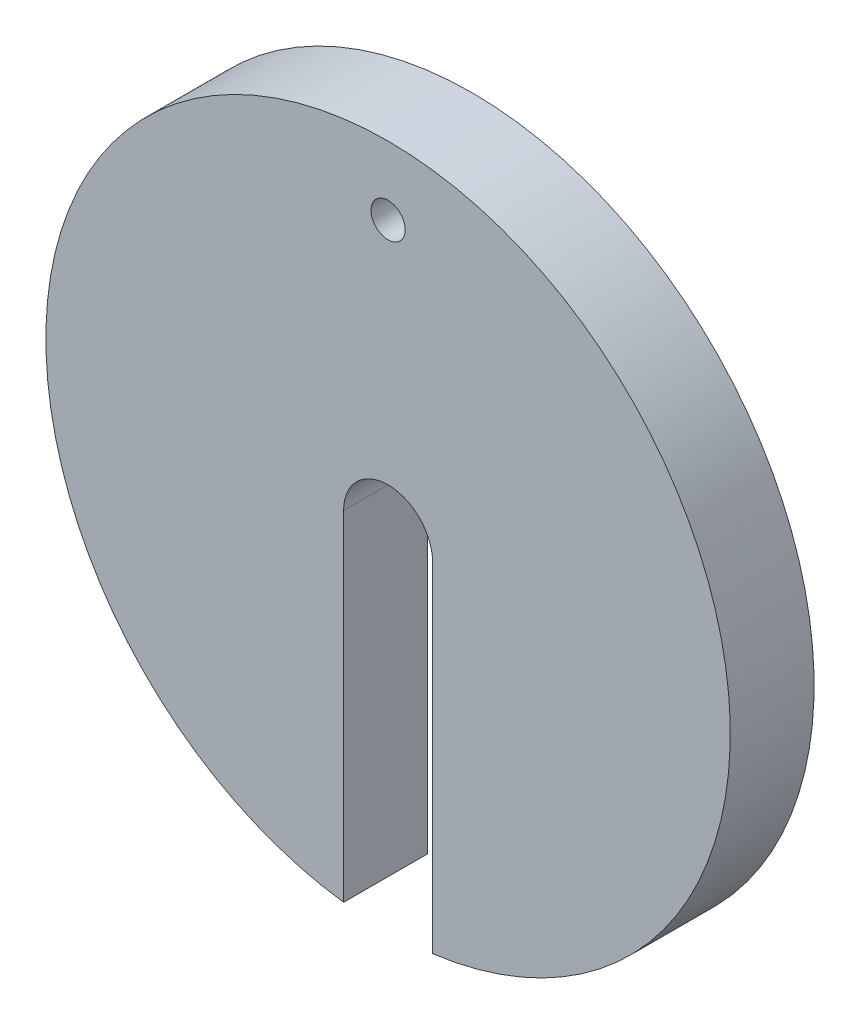
ISO-10303-21;
HEADER;
FILE_DESCRIPTION(('STEP AP214'),'2;1');
FILE_NAME('part.step','',(''),(''),'','','');
FILE_SCHEMA(('AUTOMOTIVE_DESIGN { 1 0 10303 214 1 1 1 1 }'));
ENDSEC;
DATA;
#1=APPLICATION_CONTEXT('core data for automotive mechanical design processes');
#2=APPLICATION_PROTOCOL_DEFINITION('international standard','automotive_design',2000,#1);
#3=PRODUCT_CONTEXT('',#1,'mechanical');
#4=PRODUCT('Part','Part','',(#3));
#5=PRODUCT_RELATED_PRODUCT_CATEGORY('part','',(#4));
#6=PRODUCT_DEFINITION_FORMATION('','',#4);
#7=PRODUCT_DEFINITION_CONTEXT('part definition',#1,'design');
#8=PRODUCT_DEFINITION('design','',#6,#7);
#9=PRODUCT_DEFINITION_SHAPE('','',#8);
#10=(LENGTH_UNIT() NAMED_UNIT(*) SI_UNIT(.MILLI.,.METRE.));
#11=(NAMED_UNIT(*) PLANE_ANGLE_UNIT() SI_UNIT($,.RADIAN.));
#12=(NAMED_UNIT(*) SI_UNIT($,.STERADIAN.) SOLID_ANGLE_UNIT());
#13=UNCERTAINTY_MEASURE_WITH_UNIT(LENGTH_MEASURE(1.E-05),#10,'distance_accuracy_value','');
#14=(GEOMETRIC_REPRESENTATION_CONTEXT(3) GLOBAL_UNCERTAINTY_ASSIGNED_CONTEXT((#13)) GLOBAL_UNIT_ASSIGNED_CONTEXT((#10,
#11,#12)) REPRESENTATION_CONTEXT('',''));
#15=CARTESIAN_POINT('',(0.,0.,0.));
#16=DIRECTION('',(0.,0.,1.));
#17=DIRECTION('',(1.,0.,0.));
#18=AXIS2_PLACEMENT_3D('',#15,#16,#17);
#19=CARTESIAN_POINT('',(0.,0.,12.25));
#20=DIRECTION('',(0.,0.,1.));
#21=DIRECTION('',(1.,0.,0.));
#22=AXIS2_PLACEMENT_3D('',#19,#20,#21);
#23=PLANE('',#22);
#24=CARTESIAN_POINT('',(0.,0.,12.25));
#25=DIRECTION('',(0.,0.,-1.));
#26=DIRECTION('',(1.,0.,0.));
#27=AXIS2_PLACEMENT_3D('',#24,#25,#26);
#28=CIRCLE('',#27,6.5);
#29=CARTESIAN_POINT('',(-6.5,0.,12.25));
#30=VERTEX_POINT('',#29);
#31=CARTESIAN_POINT('',(6.5,0.,12.25));
#32=VERTEX_POINT('',#31);
#33=EDGE_CURVE('E108',#30,#32,#28,.T.);
#34=ORIENTED_EDGE('',*,*,#33,.T.);
#35=DIRECTION('',(0.,-1.,0.));
#36=VECTOR('',#35,1.);
#37=CARTESIAN_POINT('',(6.5,0.,12.25));
#38=LINE('',#37,#36);
#39=CARTESIAN_POINT('',(6.50000000000015,-49.5756996924905,12.25));
#40=VERTEX_POINT('',#39);
#41=EDGE_CURVE('E92',#32,#40,#38,.T.);
#42=ORIENTED_EDGE('',*,*,#41,.T.);
#43=CARTESIAN_POINT('',(0.,0.,12.25));
#44=DIRECTION('',(0.,0.,1.));
#45=DIRECTION('',(1.,0.,0.));
#46=AXIS2_PLACEMENT_3D('',#43,#44,#45);
#47=CIRCLE('',#46,50.);
#48=CARTESIAN_POINT('',(-6.5,-49.5756996924905,12.25));
#49=VERTEX_POINT('',#48);
#50=EDGE_CURVE('E58',#40,#49,#47,.T.);
#51=ORIENTED_EDGE('',*,*,#50,.T.);
#52=DIRECTION('',(0.,1.,0.));
#53=VECTOR('',#52,1.);
#54=CARTESIAN_POINT('',(-6.5,0.,12.25));
#55=LINE('',#54,#53);
#56=EDGE_CURVE('E53',#49,#30,#55,.T.);
#57=ORIENTED_EDGE('',*,*,#56,.T.);
#58=EDGE_LOOP('',(#34,#42,#51,#57));
#59=FACE_BOUND('',#58,.T.);
#60=CARTESIAN_POINT('',(0.,40.,12.25));
#61=DIRECTION('',(0.,0.,1.));
#62=DIRECTION('',(1.,0.,0.));
#63=AXIS2_PLACEMENT_3D('',#60,#61,#62);
#64=CIRCLE('',#63,2.5);
#65=CARTESIAN_POINT('',(2.5,40.,12.25));
#66=VERTEX_POINT('',#65);
#67=EDGE_CURVE('E97',#66,#66,#64,.T.);
#68=ORIENTED_EDGE('',*,*,#67,.F.);
#69=EDGE_LOOP('',(#68));
#70=FACE_BOUND('',#69,.T.);
#71=ADVANCED_FACE('F38',(#59,#70),#23,.T.);
#72=CARTESIAN_POINT('',(0.,0.,0.));
#73=DIRECTION('',(0.,0.,1.));
#74=DIRECTION('',(1.,0.,0.));
#75=AXIS2_PLACEMENT_3D('',#72,#73,#74);
#76=PLANE('',#75);
#77=CARTESIAN_POINT('',(0.,0.,0.));
#78=DIRECTION('',(0.,0.,-1.));
#79=DIRECTION('',(1.,0.,0.));
#80=AXIS2_PLACEMENT_3D('',#77,#78,#79);
#81=CIRCLE('',#80,6.5);
#82=CARTESIAN_POINT('',(-6.5,0.,0.));
#83=VERTEX_POINT('',#82);
#84=CARTESIAN_POINT('',(6.5,0.,0.));
#85=VERTEX_POINT('',#84);
#86=EDGE_CURVE('E84',#83,#85,#81,.T.);
#87=ORIENTED_EDGE('',*,*,#86,.F.);
#88=DIRECTION('',(0.,1.,0.));
#89=VECTOR('',#88,1.);
#90=CARTESIAN_POINT('',(-6.5,0.,0.));
#91=LINE('',#90,#89);
#92=CARTESIAN_POINT('',(-6.5,-49.5756996924905,0.));
#93=VERTEX_POINT('',#92);
#94=EDGE_CURVE('E106',#93,#83,#91,.T.);
#95=ORIENTED_EDGE('',*,*,#94,.F.);
#96=CARTESIAN_POINT('',(0.,0.,0.));
#97=DIRECTION('',(0.,0.,1.));
#98=DIRECTION('',(1.,0.,0.));
#99=AXIS2_PLACEMENT_3D('',#96,#97,#98);
#100=CIRCLE('',#99,50.);
#101=CARTESIAN_POINT('',(6.50000000000015,-49.5756996924905,0.));
#102=VERTEX_POINT('',#101);
#103=EDGE_CURVE('E85',#102,#93,#100,.T.);
#104=ORIENTED_EDGE('',*,*,#103,.F.);
#105=DIRECTION('',(0.,-1.,0.));
#106=VECTOR('',#105,1.);
#107=CARTESIAN_POINT('',(6.5,0.,0.));
#108=LINE('',#107,#106);
#109=EDGE_CURVE('E79',#85,#102,#108,.T.);
#110=ORIENTED_EDGE('',*,*,#109,.F.);
#111=EDGE_LOOP('',(#87,#95,#104,#110));
#112=FACE_BOUND('',#111,.T.);
#113=CARTESIAN_POINT('',(0.,40.,0.));
#114=DIRECTION('',(0.,0.,1.));
#115=DIRECTION('',(1.,0.,0.));
#116=AXIS2_PLACEMENT_3D('',#113,#114,#115);
#117=CIRCLE('',#116,2.5);
#118=CARTESIAN_POINT('',(2.5,40.,0.));
#119=VERTEX_POINT('',#118);
#120=EDGE_CURVE('E100',#119,#119,#117,.T.);
#121=ORIENTED_EDGE('',*,*,#120,.T.);
#122=EDGE_LOOP('',(#121));
#123=FACE_BOUND('',#122,.T.);
#124=ADVANCED_FACE('F80',(#112,#123),#76,.F.);
#125=CARTESIAN_POINT('',(0.,0.,12.25));
#126=DIRECTION('',(0.,0.,-1.));
#127=DIRECTION('',(-1.,0.,0.));
#128=AXIS2_PLACEMENT_3D('',#125,#126,#127);
#129=CYLINDRICAL_SURFACE('',#128,6.5);
#130=ORIENTED_EDGE('',*,*,#86,.T.);
#131=DIRECTION('',(0.,0.,-1.));
#132=VECTOR('',#131,1.);
#133=CARTESIAN_POINT('',(6.5,0.,12.25));
#134=LINE('',#133,#132);
#135=EDGE_CURVE('E12',#32,#85,#134,.T.);
#136=ORIENTED_EDGE('',*,*,#135,.F.);
#137=ORIENTED_EDGE('',*,*,#33,.F.);
#138=DIRECTION('',(0.,0.,-1.));
#139=VECTOR('',#138,1.);
#140=CARTESIAN_POINT('',(-6.5,0.,12.25));
#141=LINE('',#140,#139);
#142=EDGE_CURVE('E96',#30,#83,#141,.T.);
#143=ORIENTED_EDGE('',*,*,#142,.T.);
#144=EDGE_LOOP('',(#130,#136,#137,#143));
#145=FACE_BOUND('',#144,.T.);
#146=ADVANCED_FACE('F40',(#145),#129,.F.);
#147=CARTESIAN_POINT('',(6.5,0.,12.25));
#148=DIRECTION('',(1.,0.,0.));
#149=DIRECTION('',(0.,1.,0.));
#150=AXIS2_PLACEMENT_3D('',#147,#148,#149);
#151=PLANE('',#150);
#152=ORIENTED_EDGE('',*,*,#109,.T.);
#153=DIRECTION('',(0.,0.,-1.));
#154=VECTOR('',#153,1.);
#155=CARTESIAN_POINT('',(6.50000000000015,-49.5756996924905,12.25));
#156=LINE('',#155,#154);
#157=EDGE_CURVE('E46',#40,#102,#156,.T.);
#158=ORIENTED_EDGE('',*,*,#157,.F.);
#159=ORIENTED_EDGE('',*,*,#41,.F.);
#160=ORIENTED_EDGE('',*,*,#135,.T.);
#161=EDGE_LOOP('',(#152,#158,#159,#160));
#162=FACE_BOUND('',#161,.T.);
#163=ADVANCED_FACE('F91',(#162),#151,.F.);
#164=CARTESIAN_POINT('',(0.,0.,12.25));
#165=DIRECTION('',(0.,0.,-1.));
#166=DIRECTION('',(-1.,0.,0.));
#167=AXIS2_PLACEMENT_3D('',#164,#165,#166);
#168=CYLINDRICAL_SURFACE('',#167,50.);
#169=ORIENTED_EDGE('',*,*,#103,.T.);
#170=DIRECTION('',(0.,0.,-1.));
#171=VECTOR('',#170,1.);
#172=CARTESIAN_POINT('',(-6.5,-49.5756996924905,12.25));
#173=LINE('',#172,#171);
#174=EDGE_CURVE('E114',#49,#93,#173,.T.);
#175=ORIENTED_EDGE('',*,*,#174,.F.);
#176=ORIENTED_EDGE('',*,*,#50,.F.);
#177=ORIENTED_EDGE('',*,*,#157,.T.);
#178=EDGE_LOOP('',(#169,#175,#176,#177));
#179=FACE_BOUND('',#178,.T.);
#180=ADVANCED_FACE('F117',(#179),#168,.T.);
#181=CARTESIAN_POINT('',(-6.5,0.,12.25));
#182=DIRECTION('',(-1.,0.,0.));
#183=DIRECTION('',(0.,0.,1.));
#184=AXIS2_PLACEMENT_3D('',#181,#182,#183);
#185=PLANE('',#184);
#186=ORIENTED_EDGE('',*,*,#94,.T.);
#187=ORIENTED_EDGE('',*,*,#142,.F.);
#188=ORIENTED_EDGE('',*,*,#56,.F.);
#189=ORIENTED_EDGE('',*,*,#174,.T.);
#190=EDGE_LOOP('',(#186,#187,#188,#189));
#191=FACE_BOUND('',#190,.T.);
#192=ADVANCED_FACE('F119',(#191),#185,.F.);
#193=CARTESIAN_POINT('',(0.,40.,12.25));
#194=DIRECTION('',(0.,0.,-1.));
#195=DIRECTION('',(-1.,0.,0.));
#196=AXIS2_PLACEMENT_3D('',#193,#194,#195);
#197=CYLINDRICAL_SURFACE('',#196,2.5);
#198=ORIENTED_EDGE('',*,*,#67,.T.);
#199=EDGE_LOOP('',(#198));
#200=FACE_BOUND('',#199,.T.);
#201=ORIENTED_EDGE('',*,*,#120,.F.);
#202=EDGE_LOOP('',(#201));
#203=FACE_BOUND('',#202,.T.);
#204=ADVANCED_FACE('F125',(#200,#203),#197,.F.);
#205=CLOSED_SHELL('',(#71,#124,#146,#163,#180,#192,#204));
#206=MANIFOLD_SOLID_BREP('B2',#205);
#207=ADVANCED_BREP_SHAPE_REPRESENTATION('',(#18,#206),#14);
#208=SHAPE_DEFINITION_REPRESENTATION(#9,#207);
ENDSEC;
END-ISO-10303-21;
